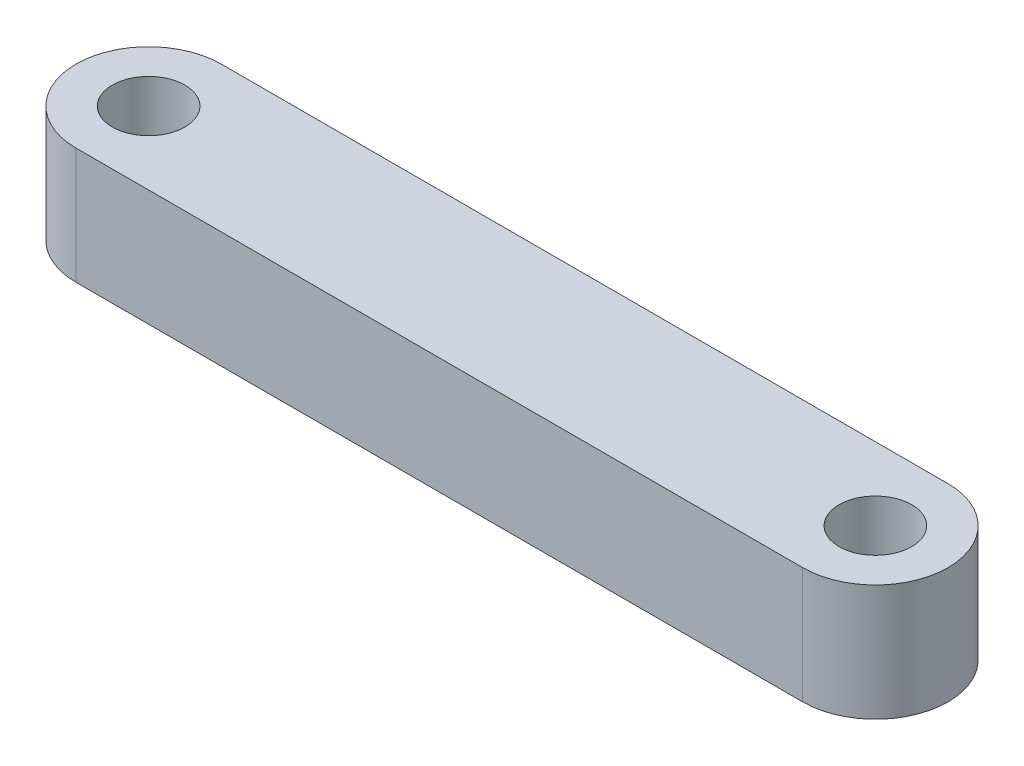
ISO-10303-21;
HEADER;
FILE_DESCRIPTION(('STEP AP214'),'2;1');
FILE_NAME('part.step','',(''),(''),'','','');
FILE_SCHEMA(('AUTOMOTIVE_DESIGN { 1 0 10303 214 1 1 1 1 }'));
ENDSEC;
DATA;
#1=APPLICATION_CONTEXT('core data for automotive mechanical design processes');
#2=APPLICATION_PROTOCOL_DEFINITION('international standard','automotive_design',2000,#1);
#3=PRODUCT_CONTEXT('',#1,'mechanical');
#4=PRODUCT('Part','Part','',(#3));
#5=PRODUCT_RELATED_PRODUCT_CATEGORY('part','',(#4));
#6=PRODUCT_DEFINITION_FORMATION('','',#4);
#7=PRODUCT_DEFINITION_CONTEXT('part definition',#1,'design');
#8=PRODUCT_DEFINITION('design','',#6,#7);
#9=PRODUCT_DEFINITION_SHAPE('','',#8);
#10=(LENGTH_UNIT() NAMED_UNIT(*) SI_UNIT(.MILLI.,.METRE.));
#11=(NAMED_UNIT(*) PLANE_ANGLE_UNIT() SI_UNIT($,.RADIAN.));
#12=(NAMED_UNIT(*) SI_UNIT($,.STERADIAN.) SOLID_ANGLE_UNIT());
#13=UNCERTAINTY_MEASURE_WITH_UNIT(LENGTH_MEASURE(1.E-05),#10,'distance_accuracy_value','');
#14=(GEOMETRIC_REPRESENTATION_CONTEXT(3) GLOBAL_UNCERTAINTY_ASSIGNED_CONTEXT((#13)) GLOBAL_UNIT_ASSIGNED_CONTEXT((#10,
#11,#12)) REPRESENTATION_CONTEXT('',''));
#15=CARTESIAN_POINT('',(0.,0.,0.));
#16=DIRECTION('',(0.,0.,1.));
#17=DIRECTION('',(1.,0.,0.));
#18=AXIS2_PLACEMENT_3D('',#15,#16,#17);
#19=CARTESIAN_POINT('',(-28.75,0.,-5.));
#20=DIRECTION('',(0.,1.,0.));
#21=DIRECTION('',(0.,0.,1.));
#22=AXIS2_PLACEMENT_3D('',#19,#20,#21);
#23=PLANE('',#22);
#24=CARTESIAN_POINT('',(26.25,0.,0.));
#25=DIRECTION('',(0.,-1.,0.));
#26=DIRECTION('',(0.,0.,-1.));
#27=AXIS2_PLACEMENT_3D('',#24,#25,#26);
#28=CIRCLE('',#27,2.50000000000001);
#29=CARTESIAN_POINT('',(26.25,0.,-2.50000000000001));
#30=VERTEX_POINT('',#29);
#31=EDGE_CURVE('E90',#30,#30,#28,.F.);
#32=ORIENTED_EDGE('',*,*,#31,.T.);
#33=EDGE_LOOP('',(#32));
#34=FACE_BOUND('',#33,.T.);
#35=CARTESIAN_POINT('',(-23.75,0.,0.));
#36=DIRECTION('',(0.,-1.,0.));
#37=DIRECTION('',(0.,0.,-1.));
#38=AXIS2_PLACEMENT_3D('',#35,#36,#37);
#39=CIRCLE('',#38,2.5);
#40=CARTESIAN_POINT('',(-23.75,0.,-2.5));
#41=VERTEX_POINT('',#40);
#42=EDGE_CURVE('E85',#41,#41,#39,.F.);
#43=ORIENTED_EDGE('',*,*,#42,.T.);
#44=EDGE_LOOP('',(#43));
#45=FACE_BOUND('',#44,.T.);
#46=DIRECTION('',(1.,0.,0.));
#47=VECTOR('',#46,1.);
#48=CARTESIAN_POINT('',(1.25000000000002,0.,-5.));
#49=LINE('',#48,#47);
#50=CARTESIAN_POINT('',(-23.75,0.,-5.));
#51=VERTEX_POINT('',#50);
#52=CARTESIAN_POINT('',(26.25,0.,-5.));
#53=VERTEX_POINT('',#52);
#54=EDGE_CURVE('E83',#51,#53,#49,.T.);
#55=ORIENTED_EDGE('',*,*,#54,.T.);
#56=CARTESIAN_POINT('',(26.25,0.,0.));
#57=DIRECTION('',(0.,1.,0.));
#58=DIRECTION('',(0.,0.,-1.));
#59=AXIS2_PLACEMENT_3D('',#56,#57,#58);
#60=CIRCLE('',#59,5.);
#61=CARTESIAN_POINT('',(26.25,0.,5.));
#62=VERTEX_POINT('',#61);
#63=EDGE_CURVE('E68',#62,#53,#60,.T.);
#64=ORIENTED_EDGE('',*,*,#63,.F.);
#65=DIRECTION('',(-1.,0.,0.));
#66=VECTOR('',#65,1.);
#67=CARTESIAN_POINT('',(1.25000000000002,0.,5.));
#68=LINE('',#67,#66);
#69=CARTESIAN_POINT('',(-23.75,0.,5.));
#70=VERTEX_POINT('',#69);
#71=EDGE_CURVE('E67',#62,#70,#68,.T.);
#72=ORIENTED_EDGE('',*,*,#71,.T.);
#73=CARTESIAN_POINT('',(-23.75,0.,0.));
#74=DIRECTION('',(0.,1.,0.));
#75=DIRECTION('',(0.,0.,1.));
#76=AXIS2_PLACEMENT_3D('',#73,#74,#75);
#77=CIRCLE('',#76,5.);
#78=EDGE_CURVE('E53',#51,#70,#77,.T.);
#79=ORIENTED_EDGE('',*,*,#78,.F.);
#80=EDGE_LOOP('',(#55,#64,#72,#79));
#81=FACE_BOUND('',#80,.T.);
#82=ADVANCED_FACE('F15',(#34,#45,#81),#23,.F.);
#83=CARTESIAN_POINT('',(-23.75,8.,0.));
#84=DIRECTION('',(0.,-1.,0.));
#85=DIRECTION('',(0.,0.,-1.));
#86=AXIS2_PLACEMENT_3D('',#83,#84,#85);
#87=CYLINDRICAL_SURFACE('',#86,5.);
#88=CARTESIAN_POINT('',(-23.75,8.,0.));
#89=DIRECTION('',(0.,-1.,0.));
#90=DIRECTION('',(0.,0.,-1.));
#91=AXIS2_PLACEMENT_3D('',#88,#89,#90);
#92=CIRCLE('',#91,5.);
#93=CARTESIAN_POINT('',(-23.75,8.,-5.));
#94=VERTEX_POINT('',#93);
#95=CARTESIAN_POINT('',(-23.75,8.,5.));
#96=VERTEX_POINT('',#95);
#97=EDGE_CURVE('E93',#94,#96,#92,.F.);
#98=ORIENTED_EDGE('',*,*,#97,.F.);
#99=DIRECTION('',(0.,-1.,0.));
#100=VECTOR('',#99,1.);
#101=CARTESIAN_POINT('',(-23.75,4.,-5.));
#102=LINE('',#101,#100);
#103=EDGE_CURVE('E61',#94,#51,#102,.T.);
#104=ORIENTED_EDGE('',*,*,#103,.T.);
#105=ORIENTED_EDGE('',*,*,#78,.T.);
#106=DIRECTION('',(0.,1.,0.));
#107=VECTOR('',#106,1.);
#108=CARTESIAN_POINT('',(-23.75,4.,5.));
#109=LINE('',#108,#107);
#110=EDGE_CURVE('E58',#70,#96,#109,.T.);
#111=ORIENTED_EDGE('',*,*,#110,.T.);
#112=EDGE_LOOP('',(#98,#104,#105,#111));
#113=FACE_BOUND('',#112,.T.);
#114=ADVANCED_FACE('F56',(#113),#87,.T.);
#115=CARTESIAN_POINT('',(26.25,0.,5.));
#116=DIRECTION('',(0.,0.,-1.));
#117=DIRECTION('',(-1.,0.,0.));
#118=AXIS2_PLACEMENT_3D('',#115,#116,#117);
#119=PLANE('',#118);
#120=DIRECTION('',(0.,-1.,0.));
#121=VECTOR('',#120,1.);
#122=CARTESIAN_POINT('',(26.25,4.,5.));
#123=LINE('',#122,#121);
#124=CARTESIAN_POINT('',(26.25,8.,5.));
#125=VERTEX_POINT('',#124);
#126=EDGE_CURVE('E97',#125,#62,#123,.T.);
#127=ORIENTED_EDGE('',*,*,#126,.F.);
#128=DIRECTION('',(1.,0.,0.));
#129=VECTOR('',#128,1.);
#130=CARTESIAN_POINT('',(1.25000000000003,8.,5.));
#131=LINE('',#130,#129);
#132=EDGE_CURVE('E74',#96,#125,#131,.T.);
#133=ORIENTED_EDGE('',*,*,#132,.F.);
#134=ORIENTED_EDGE('',*,*,#110,.F.);
#135=ORIENTED_EDGE('',*,*,#71,.F.);
#136=EDGE_LOOP('',(#127,#133,#134,#135));
#137=FACE_BOUND('',#136,.T.);
#138=ADVANCED_FACE('F72',(#137),#119,.F.);
#139=CARTESIAN_POINT('',(26.25,8.,0.));
#140=DIRECTION('',(0.,-1.,0.));
#141=DIRECTION('',(0.,0.,-1.));
#142=AXIS2_PLACEMENT_3D('',#139,#140,#141);
#143=CYLINDRICAL_SURFACE('',#142,5.);
#144=CARTESIAN_POINT('',(26.25,8.,0.));
#145=DIRECTION('',(0.,-1.,0.));
#146=DIRECTION('',(0.,0.,-1.));
#147=AXIS2_PLACEMENT_3D('',#144,#145,#146);
#148=CIRCLE('',#147,5.);
#149=CARTESIAN_POINT('',(26.25,8.,-5.));
#150=VERTEX_POINT('',#149);
#151=EDGE_CURVE('E105',#125,#150,#148,.F.);
#152=ORIENTED_EDGE('',*,*,#151,.F.);
#153=ORIENTED_EDGE('',*,*,#126,.T.);
#154=ORIENTED_EDGE('',*,*,#63,.T.);
#155=DIRECTION('',(0.,1.,0.));
#156=VECTOR('',#155,1.);
#157=CARTESIAN_POINT('',(26.25,4.,-5.));
#158=LINE('',#157,#156);
#159=EDGE_CURVE('E34',#53,#150,#158,.T.);
#160=ORIENTED_EDGE('',*,*,#159,.T.);
#161=EDGE_LOOP('',(#152,#153,#154,#160));
#162=FACE_BOUND('',#161,.T.);
#163=ADVANCED_FACE('F123',(#162),#143,.T.);
#164=CARTESIAN_POINT('',(-23.75,0.,-5.));
#165=DIRECTION('',(0.,0.,1.));
#166=DIRECTION('',(1.,0.,0.));
#167=AXIS2_PLACEMENT_3D('',#164,#165,#166);
#168=PLANE('',#167);
#169=ORIENTED_EDGE('',*,*,#103,.F.);
#170=DIRECTION('',(-1.,0.,0.));
#171=VECTOR('',#170,1.);
#172=CARTESIAN_POINT('',(1.25000000000003,8.,-5.));
#173=LINE('',#172,#171);
#174=EDGE_CURVE('E104',#150,#94,#173,.T.);
#175=ORIENTED_EDGE('',*,*,#174,.F.);
#176=ORIENTED_EDGE('',*,*,#159,.F.);
#177=ORIENTED_EDGE('',*,*,#54,.F.);
#178=EDGE_LOOP('',(#169,#175,#176,#177));
#179=FACE_BOUND('',#178,.T.);
#180=ADVANCED_FACE('F125',(#179),#168,.F.);
#181=CARTESIAN_POINT('',(-23.75,8.,0.));
#182=DIRECTION('',(0.,-1.,0.));
#183=DIRECTION('',(0.,0.,-1.));
#184=AXIS2_PLACEMENT_3D('',#181,#182,#183);
#185=CYLINDRICAL_SURFACE('',#184,2.5);
#186=CARTESIAN_POINT('',(-23.75,8.,0.));
#187=DIRECTION('',(0.,-1.,0.));
#188=DIRECTION('',(0.,0.,-1.));
#189=AXIS2_PLACEMENT_3D('',#186,#187,#188);
#190=CIRCLE('',#189,2.5);
#191=CARTESIAN_POINT('',(-23.75,8.,-2.5));
#192=VERTEX_POINT('',#191);
#193=EDGE_CURVE('E25',#192,#192,#190,.T.);
#194=ORIENTED_EDGE('',*,*,#193,.F.);
#195=EDGE_LOOP('',(#194));
#196=FACE_BOUND('',#195,.T.);
#197=ORIENTED_EDGE('',*,*,#42,.F.);
#198=EDGE_LOOP('',(#197));
#199=FACE_BOUND('',#198,.T.);
#200=ADVANCED_FACE('F127',(#196,#199),#185,.F.);
#201=CARTESIAN_POINT('',(26.25,8.,0.));
#202=DIRECTION('',(0.,-1.,0.));
#203=DIRECTION('',(0.,0.,-1.));
#204=AXIS2_PLACEMENT_3D('',#201,#202,#203);
#205=CYLINDRICAL_SURFACE('',#204,2.50000000000001);
#206=CARTESIAN_POINT('',(26.25,8.,0.));
#207=DIRECTION('',(0.,-1.,0.));
#208=DIRECTION('',(0.,0.,-1.));
#209=AXIS2_PLACEMENT_3D('',#206,#207,#208);
#210=CIRCLE('',#209,2.50000000000001);
#211=CARTESIAN_POINT('',(26.25,8.,-2.50000000000001));
#212=VERTEX_POINT('',#211);
#213=EDGE_CURVE('E10',#212,#212,#210,.T.);
#214=ORIENTED_EDGE('',*,*,#213,.F.);
#215=EDGE_LOOP('',(#214));
#216=FACE_BOUND('',#215,.T.);
#217=ORIENTED_EDGE('',*,*,#31,.F.);
#218=EDGE_LOOP('',(#217));
#219=FACE_BOUND('',#218,.T.);
#220=ADVANCED_FACE('F134',(#216,#219),#205,.F.);
#221=CARTESIAN_POINT('',(-28.75,8.,-5.));
#222=DIRECTION('',(0.,1.,0.));
#223=DIRECTION('',(0.,0.,1.));
#224=AXIS2_PLACEMENT_3D('',#221,#222,#223);
#225=PLANE('',#224);
#226=ORIENTED_EDGE('',*,*,#213,.T.);
#227=EDGE_LOOP('',(#226));
#228=FACE_BOUND('',#227,.T.);
#229=ORIENTED_EDGE('',*,*,#193,.T.);
#230=EDGE_LOOP('',(#229));
#231=FACE_BOUND('',#230,.T.);
#232=ORIENTED_EDGE('',*,*,#151,.T.);
#233=ORIENTED_EDGE('',*,*,#174,.T.);
#234=ORIENTED_EDGE('',*,*,#97,.T.);
#235=ORIENTED_EDGE('',*,*,#132,.T.);
#236=EDGE_LOOP('',(#232,#233,#234,#235));
#237=FACE_BOUND('',#236,.T.);
#238=ADVANCED_FACE('F17',(#228,#231,#237),#225,.T.);
#239=CLOSED_SHELL('',(#82,#114,#138,#163,#180,#200,#220,#238));
#240=MANIFOLD_SOLID_BREP('B1',#239);
#241=ADVANCED_BREP_SHAPE_REPRESENTATION('',(#18,#240),#14);
#242=SHAPE_DEFINITION_REPRESENTATION(#9,#241);
ENDSEC;
END-ISO-10303-21;
